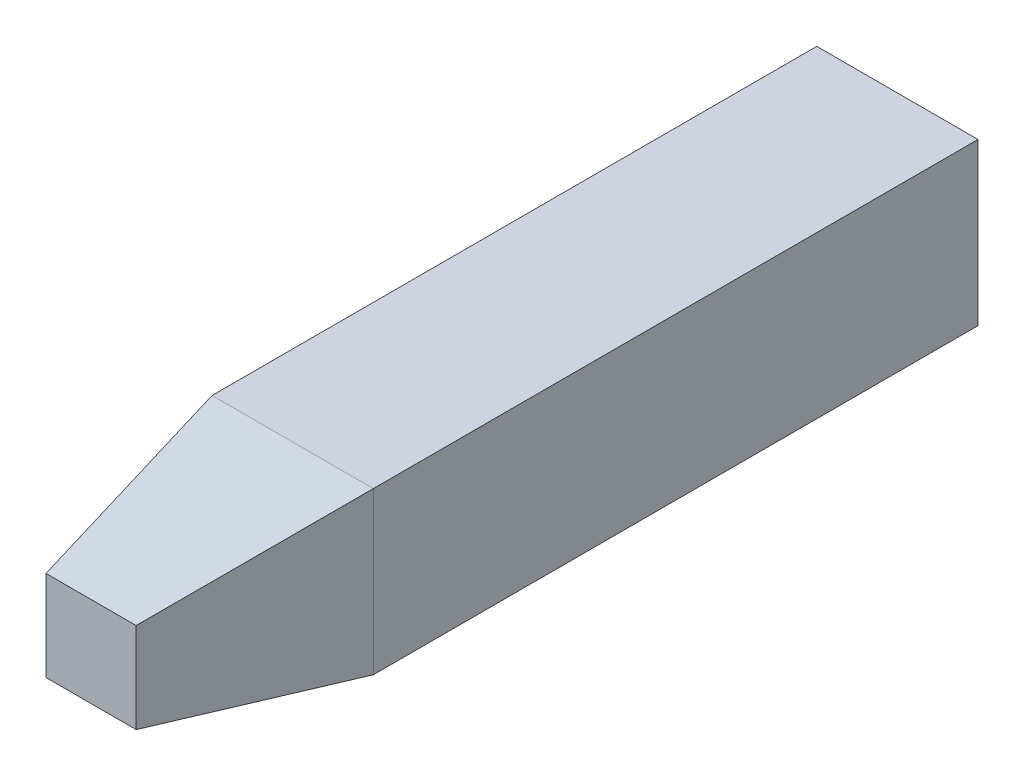
ISO-10303-21;
HEADER;
FILE_DESCRIPTION(('STEP AP214'),'2;1');
FILE_NAME('part.step','',(''),(''),'','','');
FILE_SCHEMA(('AUTOMOTIVE_DESIGN { 1 0 10303 214 1 1 1 1 }'));
ENDSEC;
DATA;
#1=APPLICATION_CONTEXT('core data for automotive mechanical design processes');
#2=APPLICATION_PROTOCOL_DEFINITION('international standard','automotive_design',2000,#1);
#3=PRODUCT_CONTEXT('',#1,'mechanical');
#4=PRODUCT('Part','Part','',(#3));
#5=PRODUCT_RELATED_PRODUCT_CATEGORY('part','',(#4));
#6=PRODUCT_DEFINITION_FORMATION('','',#4);
#7=PRODUCT_DEFINITION_CONTEXT('part definition',#1,'design');
#8=PRODUCT_DEFINITION('design','',#6,#7);
#9=PRODUCT_DEFINITION_SHAPE('','',#8);
#10=(LENGTH_UNIT() NAMED_UNIT(*) SI_UNIT(.MILLI.,.METRE.));
#11=(NAMED_UNIT(*) PLANE_ANGLE_UNIT() SI_UNIT($,.RADIAN.));
#12=(NAMED_UNIT(*) SI_UNIT($,.STERADIAN.) SOLID_ANGLE_UNIT());
#13=UNCERTAINTY_MEASURE_WITH_UNIT(LENGTH_MEASURE(1.E-05),#10,'distance_accuracy_value','');
#14=(GEOMETRIC_REPRESENTATION_CONTEXT(3) GLOBAL_UNCERTAINTY_ASSIGNED_CONTEXT((#13)) GLOBAL_UNIT_ASSIGNED_CONTEXT((#10,
#11,#12)) REPRESENTATION_CONTEXT('',''));
#15=CARTESIAN_POINT('',(0.,0.,0.));
#16=DIRECTION('',(0.,0.,1.));
#17=DIRECTION('',(1.,0.,0.));
#18=AXIS2_PLACEMENT_3D('',#15,#16,#17);
#19=CARTESIAN_POINT('',(4.,-4.,30.));
#20=DIRECTION('',(-1.,0.,0.));
#21=DIRECTION('',(0.,0.,1.));
#22=AXIS2_PLACEMENT_3D('',#19,#20,#21);
#23=PLANE('',#22);
#24=DIRECTION('',(0.,1.,0.));
#25=VECTOR('',#24,1.);
#26=CARTESIAN_POINT('',(4.,-4.,0.));
#27=LINE('',#26,#25);
#28=CARTESIAN_POINT('',(4.,-4.,0.));
#29=VERTEX_POINT('',#28);
#30=CARTESIAN_POINT('',(4.,4.,0.));
#31=VERTEX_POINT('',#30);
#32=EDGE_CURVE('E134',#29,#31,#27,.T.);
#33=ORIENTED_EDGE('',*,*,#32,.T.);
#34=DIRECTION('',(0.,0.,-1.));
#35=VECTOR('',#34,1.);
#36=CARTESIAN_POINT('',(4.,4.,30.));
#37=LINE('',#36,#35);
#38=CARTESIAN_POINT('',(4.,4.,30.));
#39=VERTEX_POINT('',#38);
#40=EDGE_CURVE('E11',#39,#31,#37,.T.);
#41=ORIENTED_EDGE('',*,*,#40,.F.);
#42=DIRECTION('',(0.,1.,0.));
#43=VECTOR('',#42,1.);
#44=CARTESIAN_POINT('',(4.,-4.,30.));
#45=LINE('',#44,#43);
#46=CARTESIAN_POINT('',(4.,-4.,30.));
#47=VERTEX_POINT('',#46);
#48=EDGE_CURVE('E100',#47,#39,#45,.T.);
#49=ORIENTED_EDGE('',*,*,#48,.F.);
#50=DIRECTION('',(0.,0.,-1.));
#51=VECTOR('',#50,1.);
#52=CARTESIAN_POINT('',(4.,-4.,30.));
#53=LINE('',#52,#51);
#54=EDGE_CURVE('E102',#47,#29,#53,.T.);
#55=ORIENTED_EDGE('',*,*,#54,.T.);
#56=EDGE_LOOP('',(#33,#41,#49,#55));
#57=FACE_BOUND('',#56,.T.);
#58=ADVANCED_FACE('F39',(#57),#23,.F.);
#59=CARTESIAN_POINT('',(-4.,4.,30.));
#60=DIRECTION('',(0.,-1.,0.));
#61=DIRECTION('',(0.,0.,-1.));
#62=AXIS2_PLACEMENT_3D('',#59,#60,#61);
#63=PLANE('',#62);
#64=DIRECTION('',(-1.,0.,0.));
#65=VECTOR('',#64,1.);
#66=CARTESIAN_POINT('',(-4.,4.,0.));
#67=LINE('',#66,#65);
#68=CARTESIAN_POINT('',(-4.,4.,0.));
#69=VERTEX_POINT('',#68);
#70=EDGE_CURVE('E158',#31,#69,#67,.T.);
#71=ORIENTED_EDGE('',*,*,#70,.T.);
#72=DIRECTION('',(0.,0.,-1.));
#73=VECTOR('',#72,1.);
#74=CARTESIAN_POINT('',(-4.,4.,30.));
#75=LINE('',#74,#73);
#76=CARTESIAN_POINT('',(-4.,4.,30.));
#77=VERTEX_POINT('',#76);
#78=EDGE_CURVE('E48',#77,#69,#75,.T.);
#79=ORIENTED_EDGE('',*,*,#78,.F.);
#80=DIRECTION('',(-1.,0.,0.));
#81=VECTOR('',#80,1.);
#82=CARTESIAN_POINT('',(-4.,4.,30.));
#83=LINE('',#82,#81);
#84=EDGE_CURVE('E82',#39,#77,#83,.T.);
#85=ORIENTED_EDGE('',*,*,#84,.F.);
#86=ORIENTED_EDGE('',*,*,#40,.T.);
#87=EDGE_LOOP('',(#71,#79,#85,#86));
#88=FACE_BOUND('',#87,.T.);
#89=ADVANCED_FACE('F170',(#88),#63,.F.);
#90=CARTESIAN_POINT('',(-4.,-4.,30.));
#91=DIRECTION('',(1.,0.,0.));
#92=DIRECTION('',(0.,0.,-1.));
#93=AXIS2_PLACEMENT_3D('',#90,#91,#92);
#94=PLANE('',#93);
#95=DIRECTION('',(0.,-1.,0.));
#96=VECTOR('',#95,1.);
#97=CARTESIAN_POINT('',(-4.,-4.,0.));
#98=LINE('',#97,#96);
#99=CARTESIAN_POINT('',(-4.,-4.,0.));
#100=VERTEX_POINT('',#99);
#101=EDGE_CURVE('E72',#69,#100,#98,.T.);
#102=ORIENTED_EDGE('',*,*,#101,.T.);
#103=DIRECTION('',(0.,0.,-1.));
#104=VECTOR('',#103,1.);
#105=CARTESIAN_POINT('',(-4.,-4.,30.));
#106=LINE('',#105,#104);
#107=CARTESIAN_POINT('',(-4.,-4.,30.));
#108=VERTEX_POINT('',#107);
#109=EDGE_CURVE('E56',#108,#100,#106,.T.);
#110=ORIENTED_EDGE('',*,*,#109,.F.);
#111=DIRECTION('',(0.,-1.,0.));
#112=VECTOR('',#111,1.);
#113=CARTESIAN_POINT('',(-4.,-4.,30.));
#114=LINE('',#113,#112);
#115=EDGE_CURVE('E125',#77,#108,#114,.T.);
#116=ORIENTED_EDGE('',*,*,#115,.F.);
#117=ORIENTED_EDGE('',*,*,#78,.T.);
#118=EDGE_LOOP('',(#102,#110,#116,#117));
#119=FACE_BOUND('',#118,.T.);
#120=ADVANCED_FACE('F167',(#119),#94,.F.);
#121=CARTESIAN_POINT('',(-4.,-4.,30.));
#122=DIRECTION('',(0.,1.,0.));
#123=DIRECTION('',(0.,0.,1.));
#124=AXIS2_PLACEMENT_3D('',#121,#122,#123);
#125=PLANE('',#124);
#126=DIRECTION('',(1.,0.,0.));
#127=VECTOR('',#126,1.);
#128=CARTESIAN_POINT('',(-4.,-4.,0.));
#129=LINE('',#128,#127);
#130=EDGE_CURVE('E77',#100,#29,#129,.T.);
#131=ORIENTED_EDGE('',*,*,#130,.T.);
#132=ORIENTED_EDGE('',*,*,#54,.F.);
#133=DIRECTION('',(1.,0.,0.));
#134=VECTOR('',#133,1.);
#135=CARTESIAN_POINT('',(-4.,-4.,30.));
#136=LINE('',#135,#134);
#137=EDGE_CURVE('E112',#108,#47,#136,.T.);
#138=ORIENTED_EDGE('',*,*,#137,.F.);
#139=ORIENTED_EDGE('',*,*,#109,.T.);
#140=EDGE_LOOP('',(#131,#132,#138,#139));
#141=FACE_BOUND('',#140,.T.);
#142=ADVANCED_FACE('F111',(#141),#125,.F.);
#143=CARTESIAN_POINT('',(0.,0.,0.));
#144=DIRECTION('',(0.,0.,-1.));
#145=DIRECTION('',(-1.,0.,0.));
#146=AXIS2_PLACEMENT_3D('',#143,#144,#145);
#147=PLANE('',#146);
#148=ORIENTED_EDGE('',*,*,#32,.F.);
#149=ORIENTED_EDGE('',*,*,#130,.F.);
#150=ORIENTED_EDGE('',*,*,#101,.F.);
#151=ORIENTED_EDGE('',*,*,#70,.F.);
#152=EDGE_LOOP('',(#148,#149,#150,#151));
#153=FACE_BOUND('',#152,.T.);
#154=ADVANCED_FACE('F169',(#153),#147,.T.);
#155=CARTESIAN_POINT('',(-4.,4.,30.));
#156=DIRECTION('',(-0.984807753012208,0.,0.173648177666931));
#157=DIRECTION('',(0.173648177666931,0.,0.984807753012208));
#158=AXIS2_PLACEMENT_3D('',#155,#156,#157);
#159=PLANE('',#158);
#160=ORIENTED_EDGE('',*,*,#115,.T.);
#161=DIRECTION('',(-0.171087869746036,-0.171087869746036,-0.970287525247814));
#162=VECTOR('',#161,1.);
#163=CARTESIAN_POINT('',(-4.,-4.,30.));
#164=LINE('',#163,#162);
#165=CARTESIAN_POINT('',(-2.23673019291534,-2.23673019291535,40.));
#166=VERTEX_POINT('',#165);
#167=EDGE_CURVE('E122',#166,#108,#164,.T.);
#168=ORIENTED_EDGE('',*,*,#167,.F.);
#169=DIRECTION('',(0.,1.,0.));
#170=VECTOR('',#169,1.);
#171=CARTESIAN_POINT('',(-2.23673019291534,4.,40.));
#172=LINE('',#171,#170);
#173=CARTESIAN_POINT('',(-2.23673019291534,2.23673019291535,40.));
#174=VERTEX_POINT('',#173);
#175=EDGE_CURVE('E140',#174,#166,#172,.F.);
#176=ORIENTED_EDGE('',*,*,#175,.F.);
#177=DIRECTION('',(-0.171087869746036,0.171087869746036,-0.970287525247814));
#178=VECTOR('',#177,1.);
#179=CARTESIAN_POINT('',(-4.,4.,30.));
#180=LINE('',#179,#178);
#181=EDGE_CURVE('E136',#174,#77,#180,.T.);
#182=ORIENTED_EDGE('',*,*,#181,.T.);
#183=EDGE_LOOP('',(#160,#168,#176,#182));
#184=FACE_BOUND('',#183,.T.);
#185=ADVANCED_FACE('F182',(#184),#159,.T.);
#186=CARTESIAN_POINT('',(-4.,-4.,30.));
#187=DIRECTION('',(0.,-0.984807753012208,0.173648177666931));
#188=DIRECTION('',(0.,-0.173648177666931,-0.984807753012208));
#189=AXIS2_PLACEMENT_3D('',#186,#187,#188);
#190=PLANE('',#189);
#191=ORIENTED_EDGE('',*,*,#137,.T.);
#192=DIRECTION('',(0.171087869746036,-0.171087869746036,-0.970287525247814));
#193=VECTOR('',#192,1.);
#194=CARTESIAN_POINT('',(3.76583152660611,-3.76583152660611,31.3280354058864));
#195=LINE('',#194,#193);
#196=CARTESIAN_POINT('',(2.23673019291535,-2.23673019291535,40.));
#197=VERTEX_POINT('',#196);
#198=EDGE_CURVE('E119',#197,#47,#195,.T.);
#199=ORIENTED_EDGE('',*,*,#198,.F.);
#200=DIRECTION('',(-1.,0.,0.));
#201=VECTOR('',#200,1.);
#202=CARTESIAN_POINT('',(-4.,-2.23673019291535,40.));
#203=LINE('',#202,#201);
#204=EDGE_CURVE('E144',#166,#197,#203,.F.);
#205=ORIENTED_EDGE('',*,*,#204,.F.);
#206=ORIENTED_EDGE('',*,*,#167,.T.);
#207=EDGE_LOOP('',(#191,#199,#205,#206));
#208=FACE_BOUND('',#207,.T.);
#209=ADVANCED_FACE('F118',(#208),#190,.T.);
#210=CARTESIAN_POINT('',(4.,4.,30.));
#211=DIRECTION('',(0.984807753012208,0.,0.173648177666931));
#212=DIRECTION('',(0.173648177666931,0.,-0.984807753012208));
#213=AXIS2_PLACEMENT_3D('',#210,#211,#212);
#214=PLANE('',#213);
#215=ORIENTED_EDGE('',*,*,#48,.T.);
#216=DIRECTION('',(0.171087869746036,0.171087869746036,-0.970287525247814));
#217=VECTOR('',#216,1.);
#218=CARTESIAN_POINT('',(3.76583152660611,3.76583152660611,31.3280354058864));
#219=LINE('',#218,#217);
#220=CARTESIAN_POINT('',(2.23673019291535,2.23673019291535,40.));
#221=VERTEX_POINT('',#220);
#222=EDGE_CURVE('E130',#221,#39,#219,.T.);
#223=ORIENTED_EDGE('',*,*,#222,.F.);
#224=DIRECTION('',(0.,-1.,0.));
#225=VECTOR('',#224,1.);
#226=CARTESIAN_POINT('',(2.23673019291535,4.,40.));
#227=LINE('',#226,#225);
#228=EDGE_CURVE('E128',#197,#221,#227,.F.);
#229=ORIENTED_EDGE('',*,*,#228,.F.);
#230=ORIENTED_EDGE('',*,*,#198,.T.);
#231=EDGE_LOOP('',(#215,#223,#229,#230));
#232=FACE_BOUND('',#231,.T.);
#233=ADVANCED_FACE('F127',(#232),#214,.T.);
#234=CARTESIAN_POINT('',(-4.,4.,30.));
#235=DIRECTION('',(0.,0.984807753012208,0.173648177666931));
#236=DIRECTION('',(0.,-0.173648177666931,0.984807753012208));
#237=AXIS2_PLACEMENT_3D('',#234,#235,#236);
#238=PLANE('',#237);
#239=ORIENTED_EDGE('',*,*,#84,.T.);
#240=ORIENTED_EDGE('',*,*,#181,.F.);
#241=DIRECTION('',(1.,0.,0.));
#242=VECTOR('',#241,1.);
#243=CARTESIAN_POINT('',(-4.,2.23673019291535,40.));
#244=LINE('',#243,#242);
#245=EDGE_CURVE('E149',#221,#174,#244,.F.);
#246=ORIENTED_EDGE('',*,*,#245,.F.);
#247=ORIENTED_EDGE('',*,*,#222,.T.);
#248=EDGE_LOOP('',(#239,#240,#246,#247));
#249=FACE_BOUND('',#248,.T.);
#250=ADVANCED_FACE('F187',(#249),#238,.T.);
#251=CARTESIAN_POINT('',(0.,0.,40.));
#252=DIRECTION('',(0.,0.,1.));
#253=DIRECTION('',(1.,0.,0.));
#254=AXIS2_PLACEMENT_3D('',#251,#252,#253);
#255=PLANE('',#254);
#256=ORIENTED_EDGE('',*,*,#175,.T.);
#257=ORIENTED_EDGE('',*,*,#204,.T.);
#258=ORIENTED_EDGE('',*,*,#228,.T.);
#259=ORIENTED_EDGE('',*,*,#245,.T.);
#260=EDGE_LOOP('',(#256,#257,#258,#259));
#261=FACE_BOUND('',#260,.T.);
#262=ADVANCED_FACE('F190',(#261),#255,.T.);
#263=CLOSED_SHELL('',(#58,#89,#120,#142,#154,#185,#209,#233,#250,#262));
#264=MANIFOLD_SOLID_BREP('B2',#263);
#265=ADVANCED_BREP_SHAPE_REPRESENTATION('',(#18,#264),#14);
#266=SHAPE_DEFINITION_REPRESENTATION(#9,#265);
ENDSEC;
END-ISO-10303-21;
